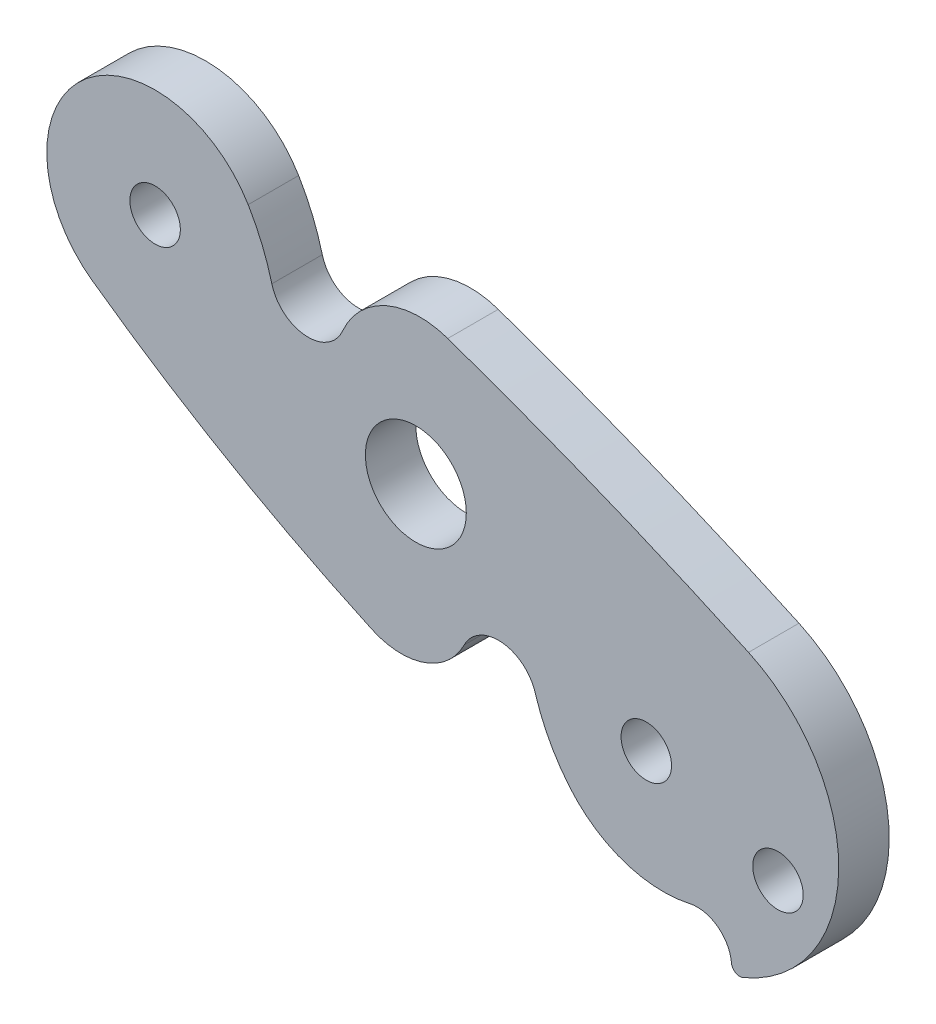
ISO-10303-21;
HEADER;
FILE_DESCRIPTION(('STEP AP214'),'2;1');
FILE_NAME('part.step','',(''),(''),'','','');
FILE_SCHEMA(('AUTOMOTIVE_DESIGN { 1 0 10303 214 1 1 1 1 }'));
ENDSEC;
DATA;
#1=APPLICATION_CONTEXT('core data for automotive mechanical design processes');
#2=APPLICATION_PROTOCOL_DEFINITION('international standard','automotive_design',2000,#1);
#3=PRODUCT_CONTEXT('',#1,'mechanical');
#4=PRODUCT('Part','Part','',(#3));
#5=PRODUCT_RELATED_PRODUCT_CATEGORY('part','',(#4));
#6=PRODUCT_DEFINITION_FORMATION('','',#4);
#7=PRODUCT_DEFINITION_CONTEXT('part definition',#1,'design');
#8=PRODUCT_DEFINITION('design','',#6,#7);
#9=PRODUCT_DEFINITION_SHAPE('','',#8);
#10=(LENGTH_UNIT() NAMED_UNIT(*) SI_UNIT(.MILLI.,.METRE.));
#11=(NAMED_UNIT(*) PLANE_ANGLE_UNIT() SI_UNIT($,.RADIAN.));
#12=(NAMED_UNIT(*) SI_UNIT($,.STERADIAN.) SOLID_ANGLE_UNIT());
#13=UNCERTAINTY_MEASURE_WITH_UNIT(LENGTH_MEASURE(1.E-05),#10,'distance_accuracy_value','');
#14=(GEOMETRIC_REPRESENTATION_CONTEXT(3) GLOBAL_UNCERTAINTY_ASSIGNED_CONTEXT((#13)) GLOBAL_UNIT_ASSIGNED_CONTEXT((#10,
#11,#12)) REPRESENTATION_CONTEXT('',''));
#15=CARTESIAN_POINT('',(0.,0.,0.));
#16=DIRECTION('',(0.,0.,1.));
#17=DIRECTION('',(1.,0.,0.));
#18=AXIS2_PLACEMENT_3D('',#15,#16,#17);
#19=CARTESIAN_POINT('',(-13.7132078601223,4.69509018132853,3.));
#20=DIRECTION('',(0.,0.,-1.));
#21=DIRECTION('',(-1.,0.,0.));
#22=AXIS2_PLACEMENT_3D('',#19,#20,#21);
#23=PLANE('',#22);
#24=CARTESIAN_POINT('',(16.7317097246749,-15.4539776051209,3.));
#25=DIRECTION('',(0.,0.,-1.));
#26=DIRECTION('',(1.,0.,0.));
#27=AXIS2_PLACEMENT_3D('',#24,#25,#26);
#28=CIRCLE('',#27,2.03941955225173);
#29=CARTESIAN_POINT('',(16.2866879956238,-13.4637043146457,3.));
#30=VERTEX_POINT('',#29);
#31=CARTESIAN_POINT('',(18.7628065392941,-15.2699182675411,3.));
#32=VERTEX_POINT('',#31);
#33=EDGE_CURVE('E224',#30,#32,#28,.T.);
#34=ORIENTED_EDGE('',*,*,#33,.T.);
#35=CARTESIAN_POINT('',(19.2607660720388,-15.2247928451197,3.));
#36=DIRECTION('',(0.,0.,-1.));
#37=DIRECTION('',(-1.,0.,0.));
#38=AXIS2_PLACEMENT_3D('',#35,#36,#37);
#39=CIRCLE('',#38,0.5);
#40=CARTESIAN_POINT('',(19.4527401809839,-15.6864701582884,3.));
#41=VERTEX_POINT('',#40);
#42=EDGE_CURVE('E11',#32,#41,#39,.F.);
#43=ORIENTED_EDGE('',*,*,#42,.T.);
#44=CARTESIAN_POINT('',(15.9075662608866,-7.16070395398193,3.));
#45=DIRECTION('',(0.,0.,1.));
#46=DIRECTION('',(-1.,0.,0.));
#47=AXIS2_PLACEMENT_3D('',#44,#45,#46);
#48=CIRCLE('',#47,9.23346887655083);
#49=CARTESIAN_POINT('',(19.7789824771481,1.22196173031568,3.));
#50=VERTEX_POINT('',#49);
#51=EDGE_CURVE('E222',#41,#50,#48,.T.);
#52=ORIENTED_EDGE('',*,*,#51,.T.);
#53=CARTESIAN_POINT('',(-63.0619415566747,-178.151097729673,3.));
#54=DIRECTION('',(0.,0.,1.));
#55=DIRECTION('',(-1.,0.,0.));
#56=AXIS2_PLACEMENT_3D('',#53,#54,#55);
#57=CIRCLE('',#56,197.578625247809);
#58=CARTESIAN_POINT('',(1.89906195139948,8.44306396366132,3.));
#59=VERTEX_POINT('',#58);
#60=EDGE_CURVE('E220',#50,#59,#57,.T.);
#61=ORIENTED_EDGE('',*,*,#60,.T.);
#62=CARTESIAN_POINT('',(0.248718134610394,3.70261193290939,3.));
#63=DIRECTION('',(0.,0.,1.));
#64=DIRECTION('',(-1.,0.,0.));
#65=AXIS2_PLACEMENT_3D('',#62,#63,#64);
#66=CIRCLE('',#65,5.01951393757144);
#67=CARTESIAN_POINT('',(-4.35733653828079,5.69755065873813,3.));
#68=VERTEX_POINT('',#67);
#69=EDGE_CURVE('E218',#59,#68,#66,.T.);
#70=ORIENTED_EDGE('',*,*,#69,.T.);
#71=CARTESIAN_POINT('',(-6.40283865789277,6.58348269428154,3.));
#72=DIRECTION('',(0.,0.,-1.));
#73=DIRECTION('',(1.,0.,0.));
#74=AXIS2_PLACEMENT_3D('',#71,#72,#73);
#75=CIRCLE('',#74,2.22911518162234);
#76=CARTESIAN_POINT('',(-8.56110844282848,6.02596495611282,3.));
#77=VERTEX_POINT('',#76);
#78=EDGE_CURVE('E152',#68,#77,#75,.T.);
#79=ORIENTED_EDGE('',*,*,#78,.T.);
#80=CARTESIAN_POINT('',(-21.0235770623518,2.80669766837551,3.));
#81=DIRECTION('',(0.,0.,1.));
#82=DIRECTION('',(-1.,0.,0.));
#83=AXIS2_PLACEMENT_3D('',#80,#81,#82);
#84=CIRCLE('',#83,12.8715502548256);
#85=CARTESIAN_POINT('',(-9.96795061933895,9.39835375126199,3.));
#86=VERTEX_POINT('',#85);
#87=EDGE_CURVE('E147',#77,#86,#84,.T.);
#88=ORIENTED_EDGE('',*,*,#87,.T.);
#89=CARTESIAN_POINT('',(-15.5,6.1,3.));
#90=DIRECTION('',(0.,0.,1.));
#91=DIRECTION('',(1.,0.,0.));
#92=AXIS2_PLACEMENT_3D('',#89,#90,#91);
#93=CIRCLE('',#92,6.44070708995032);
#94=CARTESIAN_POINT('',(-19.2558505381288,0.867763905004456,3.));
#95=VERTEX_POINT('',#94);
#96=EDGE_CURVE('E136',#86,#95,#93,.T.);
#97=ORIENTED_EDGE('',*,*,#96,.T.);
#98=CARTESIAN_POINT('',(38.7508401787212,81.6762779389936,3.));
#99=DIRECTION('',(0.,0.,1.));
#100=DIRECTION('',(-1.,0.,0.));
#101=AXIS2_PLACEMENT_3D('',#98,#99,#100);
#102=CIRCLE('',#101,99.4725696275195);
#103=CARTESIAN_POINT('',(-2.59910438250193,-8.79456926100494,3.));
#104=VERTEX_POINT('',#103);
#105=EDGE_CURVE('E146',#95,#104,#102,.T.);
#106=ORIENTED_EDGE('',*,*,#105,.T.);
#107=CARTESIAN_POINT('',(-0.865517182056309,-5.00159917643379,3.));
#108=DIRECTION('',(0.,0.,1.));
#109=DIRECTION('',(-1.,0.,0.));
#110=AXIS2_PLACEMENT_3D('',#107,#108,#109);
#111=CIRCLE('',#110,4.17036528903651);
#112=CARTESIAN_POINT('',(2.86956903214462,-6.85661335872101,3.));
#113=VERTEX_POINT('',#112);
#114=EDGE_CURVE('E232',#104,#113,#111,.T.);
#115=ORIENTED_EDGE('',*,*,#114,.T.);
#116=CARTESIAN_POINT('',(4.91453478768485,-7.8722366298509,3.));
#117=DIRECTION('',(0.,0.,-1.));
#118=DIRECTION('',(1.,0.,0.));
#119=AXIS2_PLACEMENT_3D('',#116,#117,#118);
#120=CIRCLE('',#119,2.28328175444751);
#121=CARTESIAN_POINT('',(7.10103623724623,-7.21452318065065,3.));
#122=VERTEX_POINT('',#121);
#123=EDGE_CURVE('E230',#113,#122,#120,.T.);
#124=ORIENTED_EDGE('',*,*,#123,.T.);
#125=CARTESIAN_POINT('',(17.5577883233905,-4.06906609284972,3.));
#126=DIRECTION('',(0.,0.,1.));
#127=DIRECTION('',(-1.,0.,0.));
#128=AXIS2_PLACEMENT_3D('',#125,#126,#127);
#129=CIRCLE('',#128,10.9195954358337);
#130=CARTESIAN_POINT('',(9.10688522837044,-10.9842523781829,3.));
#131=VERTEX_POINT('',#130);
#132=EDGE_CURVE('E228',#122,#131,#129,.T.);
#133=ORIENTED_EDGE('',*,*,#132,.T.);
#134=CARTESIAN_POINT('',(14.7075569201947,-6.40134713876778,3.));
#135=DIRECTION('',(0.,0.,1.));
#136=DIRECTION('',(-1.,0.,0.));
#137=AXIS2_PLACEMENT_3D('',#134,#135,#136);
#138=CIRCLE('',#137,7.23674953505097);
#139=EDGE_CURVE('E226',#131,#30,#138,.T.);
#140=ORIENTED_EDGE('',*,*,#139,.T.);
#141=EDGE_LOOP('',(#34,#43,#52,#61,#70,#79,#88,#97,#106,#115,#124,#133,#140));
#142=FACE_BOUND('',#141,.T.);
#143=CARTESIAN_POINT('',(0.,0.,3.));
#144=DIRECTION('',(0.,0.,1.));
#145=DIRECTION('',(1.,0.,0.));
#146=AXIS2_PLACEMENT_3D('',#143,#144,#145);
#147=CIRCLE('',#146,3.);
#148=CARTESIAN_POINT('',(3.,0.,3.));
#149=VERTEX_POINT('',#148);
#150=EDGE_CURVE('E216',#149,#149,#147,.T.);
#151=ORIENTED_EDGE('',*,*,#150,.F.);
#152=EDGE_LOOP('',(#151));
#153=FACE_BOUND('',#152,.T.);
#154=CARTESIAN_POINT('',(-15.5,6.1,3.));
#155=DIRECTION('',(0.,0.,1.));
#156=DIRECTION('',(1.,0.,0.));
#157=AXIS2_PLACEMENT_3D('',#154,#155,#156);
#158=CIRCLE('',#157,1.5);
#159=CARTESIAN_POINT('',(-14.,6.1,3.));
#160=VERTEX_POINT('',#159);
#161=EDGE_CURVE('E238',#160,#160,#158,.T.);
#162=ORIENTED_EDGE('',*,*,#161,.F.);
#163=EDGE_LOOP('',(#162));
#164=FACE_BOUND('',#163,.T.);
#165=CARTESIAN_POINT('',(13.7,-6.9,3.));
#166=DIRECTION('',(0.,0.,1.));
#167=DIRECTION('',(1.,0.,0.));
#168=AXIS2_PLACEMENT_3D('',#165,#166,#167);
#169=CIRCLE('',#168,1.5);
#170=CARTESIAN_POINT('',(15.2,-6.9,3.));
#171=VERTEX_POINT('',#170);
#172=EDGE_CURVE('E244',#171,#171,#169,.T.);
#173=ORIENTED_EDGE('',*,*,#172,.F.);
#174=EDGE_LOOP('',(#173));
#175=FACE_BOUND('',#174,.T.);
#176=CARTESIAN_POINT('',(21.53,-9.6533797413361,3.));
#177=DIRECTION('',(0.,0.,1.));
#178=DIRECTION('',(1.,0.,0.));
#179=AXIS2_PLACEMENT_3D('',#176,#177,#178);
#180=CIRCLE('',#179,1.5);
#181=CARTESIAN_POINT('',(23.03,-9.6533797413361,3.));
#182=VERTEX_POINT('',#181);
#183=EDGE_CURVE('E250',#182,#182,#180,.T.);
#184=ORIENTED_EDGE('',*,*,#183,.F.);
#185=EDGE_LOOP('',(#184));
#186=FACE_BOUND('',#185,.T.);
#187=ADVANCED_FACE('F41',(#142,#153,#164,#175,#186),#23,.F.);
#188=CARTESIAN_POINT('',(-13.7132078601223,4.69509018132853,0.));
#189=DIRECTION('',(0.,0.,-1.));
#190=DIRECTION('',(-1.,0.,0.));
#191=AXIS2_PLACEMENT_3D('',#188,#189,#190);
#192=PLANE('',#191);
#193=CARTESIAN_POINT('',(13.7,-6.9,0.));
#194=DIRECTION('',(0.,0.,1.));
#195=DIRECTION('',(1.,0.,0.));
#196=AXIS2_PLACEMENT_3D('',#193,#194,#195);
#197=CIRCLE('',#196,1.5);
#198=CARTESIAN_POINT('',(15.2,-6.9,0.));
#199=VERTEX_POINT('',#198);
#200=EDGE_CURVE('E247',#199,#199,#197,.T.);
#201=ORIENTED_EDGE('',*,*,#200,.T.);
#202=EDGE_LOOP('',(#201));
#203=FACE_BOUND('',#202,.T.);
#204=CARTESIAN_POINT('',(0.,0.,0.));
#205=DIRECTION('',(0.,0.,1.));
#206=DIRECTION('',(1.,0.,0.));
#207=AXIS2_PLACEMENT_3D('',#204,#205,#206);
#208=CIRCLE('',#207,3.);
#209=CARTESIAN_POINT('',(3.,0.,0.));
#210=VERTEX_POINT('',#209);
#211=EDGE_CURVE('E235',#210,#210,#208,.T.);
#212=ORIENTED_EDGE('',*,*,#211,.T.);
#213=EDGE_LOOP('',(#212));
#214=FACE_BOUND('',#213,.T.);
#215=CARTESIAN_POINT('',(15.9075662608866,-7.16070395398193,0.));
#216=DIRECTION('',(0.,0.,1.));
#217=DIRECTION('',(-1.,0.,0.));
#218=AXIS2_PLACEMENT_3D('',#215,#216,#217);
#219=CIRCLE('',#218,9.23346887655083);
#220=CARTESIAN_POINT('',(19.4527401809839,-15.6864701582884,0.));
#221=VERTEX_POINT('',#220);
#222=CARTESIAN_POINT('',(19.7789824771481,1.22196173031568,0.));
#223=VERTEX_POINT('',#222);
#224=EDGE_CURVE('E199',#221,#223,#219,.T.);
#225=ORIENTED_EDGE('',*,*,#224,.F.);
#226=CARTESIAN_POINT('',(19.2607660720388,-15.2247928451197,0.));
#227=DIRECTION('',(0.,0.,-1.));
#228=DIRECTION('',(-1.,0.,0.));
#229=AXIS2_PLACEMENT_3D('',#226,#227,#228);
#230=CIRCLE('',#229,0.5);
#231=CARTESIAN_POINT('',(18.7628065392941,-15.2699182675411,0.));
#232=VERTEX_POINT('',#231);
#233=EDGE_CURVE('E63',#221,#232,#230,.T.);
#234=ORIENTED_EDGE('',*,*,#233,.T.);
#235=CARTESIAN_POINT('',(16.7317097246749,-15.4539776051209,0.));
#236=DIRECTION('',(0.,0.,-1.));
#237=DIRECTION('',(1.,0.,0.));
#238=AXIS2_PLACEMENT_3D('',#235,#236,#237);
#239=CIRCLE('',#238,2.03941955225173);
#240=CARTESIAN_POINT('',(16.2866879956238,-13.4637043146457,0.));
#241=VERTEX_POINT('',#240);
#242=EDGE_CURVE('E201',#241,#232,#239,.T.);
#243=ORIENTED_EDGE('',*,*,#242,.F.);
#244=CARTESIAN_POINT('',(14.7075569201947,-6.40134713876778,0.));
#245=DIRECTION('',(0.,0.,1.));
#246=DIRECTION('',(-1.,0.,0.));
#247=AXIS2_PLACEMENT_3D('',#244,#245,#246);
#248=CIRCLE('',#247,7.23674953505097);
#249=CARTESIAN_POINT('',(9.10688522837044,-10.9842523781829,0.));
#250=VERTEX_POINT('',#249);
#251=EDGE_CURVE('E203',#250,#241,#248,.T.);
#252=ORIENTED_EDGE('',*,*,#251,.F.);
#253=CARTESIAN_POINT('',(17.5577883233905,-4.06906609284972,0.));
#254=DIRECTION('',(0.,0.,1.));
#255=DIRECTION('',(-1.,0.,0.));
#256=AXIS2_PLACEMENT_3D('',#253,#254,#255);
#257=CIRCLE('',#256,10.9195954358337);
#258=CARTESIAN_POINT('',(7.10103623724623,-7.21452318065065,0.));
#259=VERTEX_POINT('',#258);
#260=EDGE_CURVE('E205',#259,#250,#257,.T.);
#261=ORIENTED_EDGE('',*,*,#260,.F.);
#262=CARTESIAN_POINT('',(4.91453478768485,-7.8722366298509,0.));
#263=DIRECTION('',(0.,0.,-1.));
#264=DIRECTION('',(1.,0.,0.));
#265=AXIS2_PLACEMENT_3D('',#262,#263,#264);
#266=CIRCLE('',#265,2.28328175444751);
#267=CARTESIAN_POINT('',(2.86956903214462,-6.85661335872101,0.));
#268=VERTEX_POINT('',#267);
#269=EDGE_CURVE('E207',#268,#259,#266,.T.);
#270=ORIENTED_EDGE('',*,*,#269,.F.);
#271=CARTESIAN_POINT('',(-0.865517182056309,-5.00159917643379,0.));
#272=DIRECTION('',(0.,0.,1.));
#273=DIRECTION('',(-1.,0.,0.));
#274=AXIS2_PLACEMENT_3D('',#271,#272,#273);
#275=CIRCLE('',#274,4.17036528903651);
#276=CARTESIAN_POINT('',(-2.59910438250193,-8.79456926100494,0.));
#277=VERTEX_POINT('',#276);
#278=EDGE_CURVE('E209',#277,#268,#275,.T.);
#279=ORIENTED_EDGE('',*,*,#278,.F.);
#280=CARTESIAN_POINT('',(38.7508401787212,81.6762779389936,0.));
#281=DIRECTION('',(0.,0.,1.));
#282=DIRECTION('',(-1.,0.,0.));
#283=AXIS2_PLACEMENT_3D('',#280,#281,#282);
#284=CIRCLE('',#283,99.4725696275195);
#285=CARTESIAN_POINT('',(-19.2558505381288,0.867763905004456,0.));
#286=VERTEX_POINT('',#285);
#287=EDGE_CURVE('E211',#286,#277,#284,.T.);
#288=ORIENTED_EDGE('',*,*,#287,.F.);
#289=CARTESIAN_POINT('',(-15.5,6.1,0.));
#290=DIRECTION('',(0.,0.,1.));
#291=DIRECTION('',(1.,0.,0.));
#292=AXIS2_PLACEMENT_3D('',#289,#290,#291);
#293=CIRCLE('',#292,6.44070708995032);
#294=CARTESIAN_POINT('',(-9.96795061933895,9.39835375126199,0.));
#295=VERTEX_POINT('',#294);
#296=EDGE_CURVE('E213',#295,#286,#293,.T.);
#297=ORIENTED_EDGE('',*,*,#296,.F.);
#298=CARTESIAN_POINT('',(-21.0235770623518,2.80669766837551,0.));
#299=DIRECTION('',(0.,0.,1.));
#300=DIRECTION('',(-1.,0.,0.));
#301=AXIS2_PLACEMENT_3D('',#298,#299,#300);
#302=CIRCLE('',#301,12.8715502548256);
#303=CARTESIAN_POINT('',(-8.56110844282848,6.02596495611282,0.));
#304=VERTEX_POINT('',#303);
#305=EDGE_CURVE('E160',#304,#295,#302,.T.);
#306=ORIENTED_EDGE('',*,*,#305,.F.);
#307=CARTESIAN_POINT('',(-6.40283865789277,6.58348269428154,0.));
#308=DIRECTION('',(0.,0.,-1.));
#309=DIRECTION('',(1.,0.,0.));
#310=AXIS2_PLACEMENT_3D('',#307,#308,#309);
#311=CIRCLE('',#310,2.22911518162234);
#312=CARTESIAN_POINT('',(-4.35733653828079,5.69755065873813,0.));
#313=VERTEX_POINT('',#312);
#314=EDGE_CURVE('E156',#313,#304,#311,.T.);
#315=ORIENTED_EDGE('',*,*,#314,.F.);
#316=CARTESIAN_POINT('',(0.248718134610394,3.70261193290939,0.));
#317=DIRECTION('',(0.,0.,1.));
#318=DIRECTION('',(-1.,0.,0.));
#319=AXIS2_PLACEMENT_3D('',#316,#317,#318);
#320=CIRCLE('',#319,5.01951393757144);
#321=CARTESIAN_POINT('',(1.89906195139948,8.44306396366132,0.));
#322=VERTEX_POINT('',#321);
#323=EDGE_CURVE('E195',#322,#313,#320,.T.);
#324=ORIENTED_EDGE('',*,*,#323,.F.);
#325=CARTESIAN_POINT('',(-63.0619415566747,-178.151097729673,0.));
#326=DIRECTION('',(0.,0.,1.));
#327=DIRECTION('',(-1.,0.,0.));
#328=AXIS2_PLACEMENT_3D('',#325,#326,#327);
#329=CIRCLE('',#328,197.578625247809);
#330=EDGE_CURVE('E197',#223,#322,#329,.T.);
#331=ORIENTED_EDGE('',*,*,#330,.F.);
#332=EDGE_LOOP('',(#225,#234,#243,#252,#261,#270,#279,#288,#297,#306,#315,#324,#331));
#333=FACE_BOUND('',#332,.T.);
#334=CARTESIAN_POINT('',(-15.5,6.1,0.));
#335=DIRECTION('',(0.,0.,1.));
#336=DIRECTION('',(1.,0.,0.));
#337=AXIS2_PLACEMENT_3D('',#334,#335,#336);
#338=CIRCLE('',#337,1.5);
#339=CARTESIAN_POINT('',(-14.,6.1,0.));
#340=VERTEX_POINT('',#339);
#341=EDGE_CURVE('E241',#340,#340,#338,.T.);
#342=ORIENTED_EDGE('',*,*,#341,.T.);
#343=EDGE_LOOP('',(#342));
#344=FACE_BOUND('',#343,.T.);
#345=CARTESIAN_POINT('',(21.53,-9.6533797413361,0.));
#346=DIRECTION('',(0.,0.,1.));
#347=DIRECTION('',(1.,0.,0.));
#348=AXIS2_PLACEMENT_3D('',#345,#346,#347);
#349=CIRCLE('',#348,1.5);
#350=CARTESIAN_POINT('',(23.03,-9.6533797413361,0.));
#351=VERTEX_POINT('',#350);
#352=EDGE_CURVE('E253',#351,#351,#349,.T.);
#353=ORIENTED_EDGE('',*,*,#352,.T.);
#354=EDGE_LOOP('',(#353));
#355=FACE_BOUND('',#354,.T.);
#356=ADVANCED_FACE('F263',(#203,#214,#333,#344,#355),#192,.T.);
#357=CARTESIAN_POINT('',(-21.0235770623518,2.80669766837551,3.));
#358=DIRECTION('',(0.,0.,-1.));
#359=DIRECTION('',(-1.,0.,0.));
#360=AXIS2_PLACEMENT_3D('',#357,#358,#359);
#361=CYLINDRICAL_SURFACE('',#360,12.8715502548256);
#362=ORIENTED_EDGE('',*,*,#305,.T.);
#363=DIRECTION('',(0.,0.,-1.));
#364=VECTOR('',#363,1.);
#365=CARTESIAN_POINT('',(-9.96795061933895,9.39835375126199,3.));
#366=LINE('',#365,#364);
#367=EDGE_CURVE('E140',#86,#295,#366,.T.);
#368=ORIENTED_EDGE('',*,*,#367,.F.);
#369=ORIENTED_EDGE('',*,*,#87,.F.);
#370=DIRECTION('',(0.,0.,-1.));
#371=VECTOR('',#370,1.);
#372=CARTESIAN_POINT('',(-8.56110844282848,6.02596495611282,3.));
#373=LINE('',#372,#371);
#374=EDGE_CURVE('E192',#77,#304,#373,.T.);
#375=ORIENTED_EDGE('',*,*,#374,.T.);
#376=EDGE_LOOP('',(#362,#368,#369,#375));
#377=FACE_BOUND('',#376,.T.);
#378=ADVANCED_FACE('F158',(#377),#361,.T.);
#379=CARTESIAN_POINT('',(-15.5,6.1,3.));
#380=DIRECTION('',(0.,0.,-1.));
#381=DIRECTION('',(-1.,0.,0.));
#382=AXIS2_PLACEMENT_3D('',#379,#380,#381);
#383=CYLINDRICAL_SURFACE('',#382,6.44070708995032);
#384=ORIENTED_EDGE('',*,*,#296,.T.);
#385=DIRECTION('',(0.,0.,-1.));
#386=VECTOR('',#385,1.);
#387=CARTESIAN_POINT('',(-19.2558505381288,0.867763905004456,3.));
#388=LINE('',#387,#386);
#389=EDGE_CURVE('E143',#95,#286,#388,.T.);
#390=ORIENTED_EDGE('',*,*,#389,.F.);
#391=ORIENTED_EDGE('',*,*,#96,.F.);
#392=ORIENTED_EDGE('',*,*,#367,.T.);
#393=EDGE_LOOP('',(#384,#390,#391,#392));
#394=FACE_BOUND('',#393,.T.);
#395=ADVANCED_FACE('F138',(#394),#383,.T.);
#396=CARTESIAN_POINT('',(38.7508401787212,81.6762779389936,3.));
#397=DIRECTION('',(0.,0.,-1.));
#398=DIRECTION('',(-1.,0.,0.));
#399=AXIS2_PLACEMENT_3D('',#396,#397,#398);
#400=CYLINDRICAL_SURFACE('',#399,99.4725696275195);
#401=ORIENTED_EDGE('',*,*,#287,.T.);
#402=DIRECTION('',(0.,0.,-1.));
#403=VECTOR('',#402,1.);
#404=CARTESIAN_POINT('',(-2.59910438250193,-8.79456926100494,3.));
#405=LINE('',#404,#403);
#406=EDGE_CURVE('E165',#104,#277,#405,.T.);
#407=ORIENTED_EDGE('',*,*,#406,.F.);
#408=ORIENTED_EDGE('',*,*,#105,.F.);
#409=ORIENTED_EDGE('',*,*,#389,.T.);
#410=EDGE_LOOP('',(#401,#407,#408,#409));
#411=FACE_BOUND('',#410,.T.);
#412=ADVANCED_FACE('F309',(#411),#400,.T.);
#413=CARTESIAN_POINT('',(-0.865517182056309,-5.00159917643379,3.));
#414=DIRECTION('',(0.,0.,-1.));
#415=DIRECTION('',(-1.,0.,0.));
#416=AXIS2_PLACEMENT_3D('',#413,#414,#415);
#417=CYLINDRICAL_SURFACE('',#416,4.17036528903651);
#418=ORIENTED_EDGE('',*,*,#278,.T.);
#419=DIRECTION('',(0.,0.,-1.));
#420=VECTOR('',#419,1.);
#421=CARTESIAN_POINT('',(2.86956903214462,-6.85661335872101,3.));
#422=LINE('',#421,#420);
#423=EDGE_CURVE('E171',#113,#268,#422,.T.);
#424=ORIENTED_EDGE('',*,*,#423,.F.);
#425=ORIENTED_EDGE('',*,*,#114,.F.);
#426=ORIENTED_EDGE('',*,*,#406,.T.);
#427=EDGE_LOOP('',(#418,#424,#425,#426));
#428=FACE_BOUND('',#427,.T.);
#429=ADVANCED_FACE('F305',(#428),#417,.T.);
#430=CARTESIAN_POINT('',(4.91453478768485,-7.8722366298509,3.));
#431=DIRECTION('',(0.,0.,-1.));
#432=DIRECTION('',(-1.,0.,0.));
#433=AXIS2_PLACEMENT_3D('',#430,#431,#432);
#434=CYLINDRICAL_SURFACE('',#433,2.28328175444751);
#435=ORIENTED_EDGE('',*,*,#269,.T.);
#436=DIRECTION('',(0.,0.,-1.));
#437=VECTOR('',#436,1.);
#438=CARTESIAN_POINT('',(7.10103623724623,-7.21452318065065,3.));
#439=LINE('',#438,#437);
#440=EDGE_CURVE('E174',#122,#259,#439,.T.);
#441=ORIENTED_EDGE('',*,*,#440,.F.);
#442=ORIENTED_EDGE('',*,*,#123,.F.);
#443=ORIENTED_EDGE('',*,*,#423,.T.);
#444=EDGE_LOOP('',(#435,#441,#442,#443));
#445=FACE_BOUND('',#444,.T.);
#446=ADVANCED_FACE('F301',(#445),#434,.F.);
#447=CARTESIAN_POINT('',(17.5577883233905,-4.06906609284972,3.));
#448=DIRECTION('',(0.,0.,-1.));
#449=DIRECTION('',(-1.,0.,0.));
#450=AXIS2_PLACEMENT_3D('',#447,#448,#449);
#451=CYLINDRICAL_SURFACE('',#450,10.9195954358337);
#452=ORIENTED_EDGE('',*,*,#260,.T.);
#453=DIRECTION('',(0.,0.,-1.));
#454=VECTOR('',#453,1.);
#455=CARTESIAN_POINT('',(9.10688522837044,-10.9842523781829,3.));
#456=LINE('',#455,#454);
#457=EDGE_CURVE('E177',#131,#250,#456,.T.);
#458=ORIENTED_EDGE('',*,*,#457,.F.);
#459=ORIENTED_EDGE('',*,*,#132,.F.);
#460=ORIENTED_EDGE('',*,*,#440,.T.);
#461=EDGE_LOOP('',(#452,#458,#459,#460));
#462=FACE_BOUND('',#461,.T.);
#463=ADVANCED_FACE('F297',(#462),#451,.T.);
#464=CARTESIAN_POINT('',(14.7075569201947,-6.40134713876778,3.));
#465=DIRECTION('',(0.,0.,-1.));
#466=DIRECTION('',(-1.,0.,0.));
#467=AXIS2_PLACEMENT_3D('',#464,#465,#466);
#468=CYLINDRICAL_SURFACE('',#467,7.23674953505097);
#469=ORIENTED_EDGE('',*,*,#251,.T.);
#470=DIRECTION('',(0.,0.,-1.));
#471=VECTOR('',#470,1.);
#472=CARTESIAN_POINT('',(16.2866879956238,-13.4637043146457,3.));
#473=LINE('',#472,#471);
#474=EDGE_CURVE('E180',#30,#241,#473,.T.);
#475=ORIENTED_EDGE('',*,*,#474,.F.);
#476=ORIENTED_EDGE('',*,*,#139,.F.);
#477=ORIENTED_EDGE('',*,*,#457,.T.);
#478=EDGE_LOOP('',(#469,#475,#476,#477));
#479=FACE_BOUND('',#478,.T.);
#480=ADVANCED_FACE('F294',(#479),#468,.T.);
#481=CARTESIAN_POINT('',(16.7317097246749,-15.4539776051209,3.));
#482=DIRECTION('',(0.,0.,-1.));
#483=DIRECTION('',(-1.,0.,0.));
#484=AXIS2_PLACEMENT_3D('',#481,#482,#483);
#485=CYLINDRICAL_SURFACE('',#484,2.03941955225173);
#486=ORIENTED_EDGE('',*,*,#242,.T.);
#487=DIRECTION('',(0.,0.,-1.));
#488=VECTOR('',#487,1.);
#489=CARTESIAN_POINT('',(18.7628065392941,-15.2699182675411,3.));
#490=LINE('',#489,#488);
#491=EDGE_CURVE('E49',#232,#32,#490,.F.);
#492=ORIENTED_EDGE('',*,*,#491,.T.);
#493=ORIENTED_EDGE('',*,*,#33,.F.);
#494=ORIENTED_EDGE('',*,*,#474,.T.);
#495=EDGE_LOOP('',(#486,#492,#493,#494));
#496=FACE_BOUND('',#495,.T.);
#497=ADVANCED_FACE('F290',(#496),#485,.F.);
#498=CARTESIAN_POINT('',(15.9075662608866,-7.16070395398193,3.));
#499=DIRECTION('',(0.,0.,-1.));
#500=DIRECTION('',(-1.,0.,0.));
#501=AXIS2_PLACEMENT_3D('',#498,#499,#500);
#502=CYLINDRICAL_SURFACE('',#501,9.23346887655083);
#503=ORIENTED_EDGE('',*,*,#51,.F.);
#504=DIRECTION('',(0.,0.,-1.));
#505=VECTOR('',#504,1.);
#506=CARTESIAN_POINT('',(19.4527401809839,-15.6864701582884,3.));
#507=LINE('',#506,#505);
#508=EDGE_CURVE('E161',#41,#221,#507,.T.);
#509=ORIENTED_EDGE('',*,*,#508,.T.);
#510=ORIENTED_EDGE('',*,*,#224,.T.);
#511=DIRECTION('',(0.,0.,-1.));
#512=VECTOR('',#511,1.);
#513=CARTESIAN_POINT('',(19.7789824771481,1.22196173031568,3.));
#514=LINE('',#513,#512);
#515=EDGE_CURVE('E183',#50,#223,#514,.T.);
#516=ORIENTED_EDGE('',*,*,#515,.F.);
#517=EDGE_LOOP('',(#503,#509,#510,#516));
#518=FACE_BOUND('',#517,.T.);
#519=ADVANCED_FACE('F286',(#518),#502,.T.);
#520=CARTESIAN_POINT('',(-63.0619415566747,-178.151097729673,3.));
#521=DIRECTION('',(0.,0.,-1.));
#522=DIRECTION('',(-1.,0.,0.));
#523=AXIS2_PLACEMENT_3D('',#520,#521,#522);
#524=CYLINDRICAL_SURFACE('',#523,197.578625247809);
#525=ORIENTED_EDGE('',*,*,#330,.T.);
#526=DIRECTION('',(0.,0.,-1.));
#527=VECTOR('',#526,1.);
#528=CARTESIAN_POINT('',(1.89906195139948,8.44306396366132,3.));
#529=LINE('',#528,#527);
#530=EDGE_CURVE('E186',#59,#322,#529,.T.);
#531=ORIENTED_EDGE('',*,*,#530,.F.);
#532=ORIENTED_EDGE('',*,*,#60,.F.);
#533=ORIENTED_EDGE('',*,*,#515,.T.);
#534=EDGE_LOOP('',(#525,#531,#532,#533));
#535=FACE_BOUND('',#534,.T.);
#536=ADVANCED_FACE('F282',(#535),#524,.T.);
#537=CARTESIAN_POINT('',(0.248718134610394,3.70261193290939,3.));
#538=DIRECTION('',(0.,0.,-1.));
#539=DIRECTION('',(-1.,0.,0.));
#540=AXIS2_PLACEMENT_3D('',#537,#538,#539);
#541=CYLINDRICAL_SURFACE('',#540,5.01951393757144);
#542=ORIENTED_EDGE('',*,*,#323,.T.);
#543=DIRECTION('',(0.,0.,-1.));
#544=VECTOR('',#543,1.);
#545=CARTESIAN_POINT('',(-4.35733653828079,5.69755065873813,3.));
#546=LINE('',#545,#544);
#547=EDGE_CURVE('E189',#68,#313,#546,.T.);
#548=ORIENTED_EDGE('',*,*,#547,.F.);
#549=ORIENTED_EDGE('',*,*,#69,.F.);
#550=ORIENTED_EDGE('',*,*,#530,.T.);
#551=EDGE_LOOP('',(#542,#548,#549,#550));
#552=FACE_BOUND('',#551,.T.);
#553=ADVANCED_FACE('F278',(#552),#541,.T.);
#554=CARTESIAN_POINT('',(-6.40283865789277,6.58348269428154,3.));
#555=DIRECTION('',(0.,0.,-1.));
#556=DIRECTION('',(-1.,0.,0.));
#557=AXIS2_PLACEMENT_3D('',#554,#555,#556);
#558=CYLINDRICAL_SURFACE('',#557,2.22911518162234);
#559=ORIENTED_EDGE('',*,*,#314,.T.);
#560=ORIENTED_EDGE('',*,*,#374,.F.);
#561=ORIENTED_EDGE('',*,*,#78,.F.);
#562=ORIENTED_EDGE('',*,*,#547,.T.);
#563=EDGE_LOOP('',(#559,#560,#561,#562));
#564=FACE_BOUND('',#563,.T.);
#565=ADVANCED_FACE('F275',(#564),#558,.F.);
#566=CARTESIAN_POINT('',(0.,0.,3.));
#567=DIRECTION('',(0.,0.,-1.));
#568=DIRECTION('',(-1.,0.,0.));
#569=AXIS2_PLACEMENT_3D('',#566,#567,#568);
#570=CYLINDRICAL_SURFACE('',#569,3.);
#571=ORIENTED_EDGE('',*,*,#150,.T.);
#572=EDGE_LOOP('',(#571));
#573=FACE_BOUND('',#572,.T.);
#574=ORIENTED_EDGE('',*,*,#211,.F.);
#575=EDGE_LOOP('',(#574));
#576=FACE_BOUND('',#575,.T.);
#577=ADVANCED_FACE('F272',(#573,#576),#570,.F.);
#578=CARTESIAN_POINT('',(-15.5,6.1,3.));
#579=DIRECTION('',(0.,0.,-1.));
#580=DIRECTION('',(-1.,0.,0.));
#581=AXIS2_PLACEMENT_3D('',#578,#579,#580);
#582=CYLINDRICAL_SURFACE('',#581,1.5);
#583=ORIENTED_EDGE('',*,*,#161,.T.);
#584=EDGE_LOOP('',(#583));
#585=FACE_BOUND('',#584,.T.);
#586=ORIENTED_EDGE('',*,*,#341,.F.);
#587=EDGE_LOOP('',(#586));
#588=FACE_BOUND('',#587,.T.);
#589=ADVANCED_FACE('F373',(#585,#588),#582,.F.);
#590=CARTESIAN_POINT('',(13.7,-6.9,3.));
#591=DIRECTION('',(0.,0.,-1.));
#592=DIRECTION('',(-1.,0.,0.));
#593=AXIS2_PLACEMENT_3D('',#590,#591,#592);
#594=CYLINDRICAL_SURFACE('',#593,1.5);
#595=ORIENTED_EDGE('',*,*,#172,.T.);
#596=EDGE_LOOP('',(#595));
#597=FACE_BOUND('',#596,.T.);
#598=ORIENTED_EDGE('',*,*,#200,.F.);
#599=EDGE_LOOP('',(#598));
#600=FACE_BOUND('',#599,.T.);
#601=ADVANCED_FACE('F381',(#597,#600),#594,.F.);
#602=CARTESIAN_POINT('',(21.53,-9.6533797413361,3.));
#603=DIRECTION('',(0.,0.,-1.));
#604=DIRECTION('',(-1.,0.,0.));
#605=AXIS2_PLACEMENT_3D('',#602,#603,#604);
#606=CYLINDRICAL_SURFACE('',#605,1.5);
#607=ORIENTED_EDGE('',*,*,#183,.T.);
#608=EDGE_LOOP('',(#607));
#609=FACE_BOUND('',#608,.T.);
#610=ORIENTED_EDGE('',*,*,#352,.F.);
#611=EDGE_LOOP('',(#610));
#612=FACE_BOUND('',#611,.T.);
#613=ADVANCED_FACE('F259',(#609,#612),#606,.F.);
#614=CARTESIAN_POINT('',(19.2607660720388,-15.2247928451197,3.));
#615=DIRECTION('',(0.,0.,1.));
#616=DIRECTION('',(1.,0.,0.));
#617=AXIS2_PLACEMENT_3D('',#614,#615,#616);
#618=CYLINDRICAL_SURFACE('',#617,0.5);
#619=ORIENTED_EDGE('',*,*,#42,.F.);
#620=ORIENTED_EDGE('',*,*,#491,.F.);
#621=ORIENTED_EDGE('',*,*,#233,.F.);
#622=ORIENTED_EDGE('',*,*,#508,.F.);
#623=EDGE_LOOP('',(#619,#620,#621,#622));
#624=FACE_BOUND('',#623,.T.);
#625=ADVANCED_FACE('F43',(#624),#618,.T.);
#626=CLOSED_SHELL('',(#187,#356,#378,#395,#412,#429,#446,#463,#480,#497,#519,#536,#553,#565,
#577,#589,#601,#613,#625));
#627=MANIFOLD_SOLID_BREP('B2',#626);
#628=ADVANCED_BREP_SHAPE_REPRESENTATION('',(#18,#627),#14);
#629=SHAPE_DEFINITION_REPRESENTATION(#9,#628);
ENDSEC;
END-ISO-10303-21;
